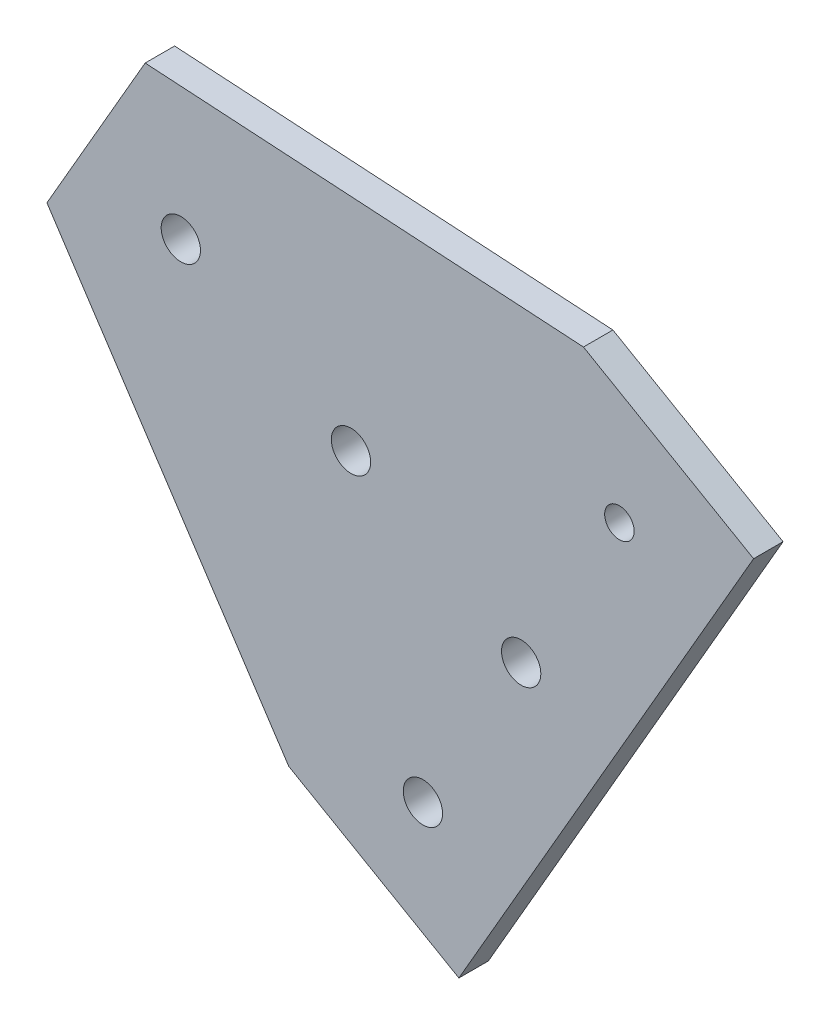
ISO-10303-21;
HEADER;
FILE_DESCRIPTION(('STEP AP214'),'2;1');
FILE_NAME('part.step','',(''),(''),'','','');
FILE_SCHEMA(('AUTOMOTIVE_DESIGN { 1 0 10303 214 1 1 1 1 }'));
ENDSEC;
DATA;
#1=APPLICATION_CONTEXT('core data for automotive mechanical design processes');
#2=APPLICATION_PROTOCOL_DEFINITION('international standard','automotive_design',2000,#1);
#3=PRODUCT_CONTEXT('',#1,'mechanical');
#4=PRODUCT('Part','Part','',(#3));
#5=PRODUCT_RELATED_PRODUCT_CATEGORY('part','',(#4));
#6=PRODUCT_DEFINITION_FORMATION('','',#4);
#7=PRODUCT_DEFINITION_CONTEXT('part definition',#1,'design');
#8=PRODUCT_DEFINITION('design','',#6,#7);
#9=PRODUCT_DEFINITION_SHAPE('','',#8);
#10=(LENGTH_UNIT() NAMED_UNIT(*) SI_UNIT(.MILLI.,.METRE.));
#11=(NAMED_UNIT(*) PLANE_ANGLE_UNIT() SI_UNIT($,.RADIAN.));
#12=(NAMED_UNIT(*) SI_UNIT($,.STERADIAN.) SOLID_ANGLE_UNIT());
#13=UNCERTAINTY_MEASURE_WITH_UNIT(LENGTH_MEASURE(1.E-05),#10,'distance_accuracy_value','');
#14=(GEOMETRIC_REPRESENTATION_CONTEXT(3) GLOBAL_UNCERTAINTY_ASSIGNED_CONTEXT((#13)) GLOBAL_UNIT_ASSIGNED_CONTEXT((#10,
#11,#12)) REPRESENTATION_CONTEXT('',''));
#15=CARTESIAN_POINT('',(0.,0.,0.));
#16=DIRECTION('',(0.,0.,1.));
#17=DIRECTION('',(1.,0.,0.));
#18=AXIS2_PLACEMENT_3D('',#15,#16,#17);
#19=CARTESIAN_POINT('',(0.,0.,3.));
#20=DIRECTION('',(0.,0.,1.));
#21=DIRECTION('',(1.,0.,0.));
#22=AXIS2_PLACEMENT_3D('',#19,#20,#21);
#23=PLANE('',#22);
#24=CARTESIAN_POINT('',(47.8724037426029,-8.33760315715482,3.));
#25=DIRECTION('',(0.,0.,1.));
#26=DIRECTION('',(1.,0.,0.));
#27=AXIS2_PLACEMENT_3D('',#24,#25,#26);
#28=CIRCLE('',#27,1.99999999999994);
#29=CARTESIAN_POINT('',(49.8724037426029,-8.33760315715482,3.));
#30=VERTEX_POINT('',#29);
#31=EDGE_CURVE('E222',#30,#30,#28,.T.);
#32=ORIENTED_EDGE('',*,*,#31,.F.);
#33=EDGE_LOOP('',(#32));
#34=FACE_BOUND('',#33,.T.);
#35=CARTESIAN_POINT('',(65.1929118182918,-18.3376031571546,3.));
#36=DIRECTION('',(0.,0.,1.));
#37=DIRECTION('',(1.,0.,0.));
#38=AXIS2_PLACEMENT_3D('',#35,#36,#37);
#39=CIRCLE('',#38,2.);
#40=CARTESIAN_POINT('',(67.1929118182918,-18.3376031571546,3.));
#41=VERTEX_POINT('',#40);
#42=EDGE_CURVE('E238',#41,#41,#39,.T.);
#43=ORIENTED_EDGE('',*,*,#42,.F.);
#44=EDGE_LOOP('',(#43));
#45=FACE_BOUND('',#44,.T.);
#46=DIRECTION('',(0.866025403784445,-0.499999999999989,0.));
#47=VECTOR('',#46,1.);
#48=CARTESIAN_POINT('',(41.5334077805559,-39.3187982834524,3.));
#49=LINE('',#48,#47);
#50=CARTESIAN_POINT('',(41.5334077805559,-39.3187982834524,3.));
#51=VERTEX_POINT('',#50);
#52=CARTESIAN_POINT('',(58.8531658561367,-49.3183652706879,3.));
#53=VERTEX_POINT('',#52);
#54=EDGE_CURVE('E152',#51,#53,#49,.T.);
#55=ORIENTED_EDGE('',*,*,#54,.T.);
#56=DIRECTION('',(0.5,0.866025403784439,0.));
#57=VECTOR('',#56,1.);
#58=CARTESIAN_POINT('',(58.8531658561367,-49.3183652706879,3.));
#59=LINE('',#58,#57);
#60=CARTESIAN_POINT('',(88.8531658561365,2.64315895637805,3.));
#61=VERTEX_POINT('',#60);
#62=EDGE_CURVE('E100',#53,#61,#59,.T.);
#63=ORIENTED_EDGE('',*,*,#62,.T.);
#64=DIRECTION('',(-0.866025403784436,0.500000000000005,0.));
#65=VECTOR('',#64,1.);
#66=CARTESIAN_POINT('',(88.8531658561365,2.64315895637805,3.));
#67=LINE('',#66,#65);
#68=CARTESIAN_POINT('',(71.532657780447,12.6431589563786,3.));
#69=VERTEX_POINT('',#68);
#70=EDGE_CURVE('E113',#61,#69,#67,.T.);
#71=ORIENTED_EDGE('',*,*,#70,.T.);
#72=DIRECTION('',(-0.9981353174639,0.0610400526805125,0.));
#73=VECTOR('',#72,1.);
#74=CARTESIAN_POINT('',(71.532657780447,12.6431589563786,3.));
#75=LINE('',#74,#73);
#76=CARTESIAN_POINT('',(26.9207630370837,15.3713585878988,3.));
#77=VERTEX_POINT('',#76);
#78=EDGE_CURVE('E107',#69,#77,#75,.T.);
#79=ORIENTED_EDGE('',*,*,#78,.T.);
#80=DIRECTION('',(-0.499999999999987,-0.866025403784446,0.));
#81=VECTOR('',#80,1.);
#82=CARTESIAN_POINT('',(26.9207630370837,15.3713585878988,3.));
#83=LINE('',#82,#81);
#84=CARTESIAN_POINT('',(16.9207630370837,-1.94914948779046,3.));
#85=VERTEX_POINT('',#84);
#86=EDGE_CURVE('E111',#77,#85,#83,.T.);
#87=ORIENTED_EDGE('',*,*,#86,.T.);
#88=DIRECTION('',(0.55004300363725,-0.835136332672524,0.));
#89=VECTOR('',#88,1.);
#90=CARTESIAN_POINT('',(16.9207630370837,-1.94914948779046,3.));
#91=LINE('',#90,#89);
#92=EDGE_CURVE('E63',#85,#51,#91,.T.);
#93=ORIENTED_EDGE('',*,*,#92,.T.);
#94=EDGE_LOOP('',(#55,#63,#71,#79,#87,#93));
#95=FACE_BOUND('',#94,.T.);
#96=CARTESIAN_POINT('',(55.1929118182921,-35.6581112328436,3.));
#97=DIRECTION('',(0.,0.,1.));
#98=DIRECTION('',(1.,0.,0.));
#99=AXIS2_PLACEMENT_3D('',#96,#97,#98);
#100=CIRCLE('',#99,1.99999999999994);
#101=CARTESIAN_POINT('',(57.1929118182921,-35.6581112328436,3.));
#102=VERTEX_POINT('',#101);
#103=EDGE_CURVE('E140',#102,#102,#100,.T.);
#104=ORIENTED_EDGE('',*,*,#103,.F.);
#105=EDGE_LOOP('',(#104));
#106=FACE_BOUND('',#105,.T.);
#107=CARTESIAN_POINT('',(75.1929118182916,-1.01709508146575,3.));
#108=DIRECTION('',(0.,0.,1.));
#109=DIRECTION('',(1.,0.,0.));
#110=AXIS2_PLACEMENT_3D('',#107,#108,#109);
#111=CIRCLE('',#110,1.50000000000002);
#112=CARTESIAN_POINT('',(76.6929118182917,-1.01709508146575,3.));
#113=VERTEX_POINT('',#112);
#114=EDGE_CURVE('E230',#113,#113,#111,.T.);
#115=ORIENTED_EDGE('',*,*,#114,.F.);
#116=EDGE_LOOP('',(#115));
#117=FACE_BOUND('',#116,.T.);
#118=CARTESIAN_POINT('',(30.551895666914,1.66239684284486,3.));
#119=DIRECTION('',(0.,0.,1.));
#120=DIRECTION('',(1.,0.,0.));
#121=AXIS2_PLACEMENT_3D('',#118,#119,#120);
#122=CIRCLE('',#121,1.99999999999994);
#123=CARTESIAN_POINT('',(32.551895666914,1.66239684284486,3.));
#124=VERTEX_POINT('',#123);
#125=EDGE_CURVE('E211',#124,#124,#122,.T.);
#126=ORIENTED_EDGE('',*,*,#125,.F.);
#127=EDGE_LOOP('',(#126));
#128=FACE_BOUND('',#127,.T.);
#129=ADVANCED_FACE('F45',(#34,#45,#95,#106,#117,#128),#23,.T.);
#130=CARTESIAN_POINT('',(0.,0.,0.));
#131=DIRECTION('',(0.,0.,1.));
#132=DIRECTION('',(1.,0.,0.));
#133=AXIS2_PLACEMENT_3D('',#130,#131,#132);
#134=PLANE('',#133);
#135=DIRECTION('',(0.866025403784445,-0.499999999999989,0.));
#136=VECTOR('',#135,1.);
#137=CARTESIAN_POINT('',(41.5334077805559,-39.3187982834524,0.));
#138=LINE('',#137,#136);
#139=CARTESIAN_POINT('',(41.5334077805559,-39.3187982834524,0.));
#140=VERTEX_POINT('',#139);
#141=CARTESIAN_POINT('',(58.8531658561367,-49.3183652706879,0.));
#142=VERTEX_POINT('',#141);
#143=EDGE_CURVE('E135',#140,#142,#138,.T.);
#144=ORIENTED_EDGE('',*,*,#143,.F.);
#145=DIRECTION('',(0.55004300363725,-0.835136332672524,0.));
#146=VECTOR('',#145,1.);
#147=CARTESIAN_POINT('',(16.9207630370837,-1.94914948779046,0.));
#148=LINE('',#147,#146);
#149=CARTESIAN_POINT('',(16.9207630370837,-1.94914948779046,0.));
#150=VERTEX_POINT('',#149);
#151=EDGE_CURVE('E92',#150,#140,#148,.T.);
#152=ORIENTED_EDGE('',*,*,#151,.F.);
#153=DIRECTION('',(-0.499999999999987,-0.866025403784446,0.));
#154=VECTOR('',#153,1.);
#155=CARTESIAN_POINT('',(26.9207630370837,15.3713585878988,0.));
#156=LINE('',#155,#154);
#157=CARTESIAN_POINT('',(26.9207630370837,15.3713585878988,0.));
#158=VERTEX_POINT('',#157);
#159=EDGE_CURVE('E86',#158,#150,#156,.T.);
#160=ORIENTED_EDGE('',*,*,#159,.F.);
#161=DIRECTION('',(-0.9981353174639,0.0610400526805125,0.));
#162=VECTOR('',#161,1.);
#163=CARTESIAN_POINT('',(71.532657780447,12.6431589563786,0.));
#164=LINE('',#163,#162);
#165=CARTESIAN_POINT('',(71.532657780447,12.6431589563786,0.));
#166=VERTEX_POINT('',#165);
#167=EDGE_CURVE('E122',#166,#158,#164,.T.);
#168=ORIENTED_EDGE('',*,*,#167,.F.);
#169=DIRECTION('',(-0.866025403784436,0.500000000000005,0.));
#170=VECTOR('',#169,1.);
#171=CARTESIAN_POINT('',(88.8531658561365,2.64315895637805,0.));
#172=LINE('',#171,#170);
#173=CARTESIAN_POINT('',(88.8531658561365,2.64315895637805,0.));
#174=VERTEX_POINT('',#173);
#175=EDGE_CURVE('E143',#174,#166,#172,.T.);
#176=ORIENTED_EDGE('',*,*,#175,.F.);
#177=DIRECTION('',(0.5,0.866025403784439,0.));
#178=VECTOR('',#177,1.);
#179=CARTESIAN_POINT('',(58.8531658561367,-49.3183652706879,0.));
#180=LINE('',#179,#178);
#181=EDGE_CURVE('E139',#142,#174,#180,.T.);
#182=ORIENTED_EDGE('',*,*,#181,.F.);
#183=EDGE_LOOP('',(#144,#152,#160,#168,#176,#182));
#184=FACE_BOUND('',#183,.T.);
#185=CARTESIAN_POINT('',(55.1929118182921,-35.6581112328436,0.));
#186=DIRECTION('',(0.,0.,1.));
#187=DIRECTION('',(1.,0.,0.));
#188=AXIS2_PLACEMENT_3D('',#185,#186,#187);
#189=CIRCLE('',#188,1.99999999999994);
#190=CARTESIAN_POINT('',(57.1929118182921,-35.6581112328436,0.));
#191=VERTEX_POINT('',#190);
#192=EDGE_CURVE('E242',#191,#191,#189,.T.);
#193=ORIENTED_EDGE('',*,*,#192,.T.);
#194=EDGE_LOOP('',(#193));
#195=FACE_BOUND('',#194,.T.);
#196=CARTESIAN_POINT('',(65.1929118182918,-18.3376031571546,0.));
#197=DIRECTION('',(0.,0.,1.));
#198=DIRECTION('',(1.,0.,0.));
#199=AXIS2_PLACEMENT_3D('',#196,#197,#198);
#200=CIRCLE('',#199,2.);
#201=CARTESIAN_POINT('',(67.1929118182918,-18.3376031571546,0.));
#202=VERTEX_POINT('',#201);
#203=EDGE_CURVE('E234',#202,#202,#200,.T.);
#204=ORIENTED_EDGE('',*,*,#203,.T.);
#205=EDGE_LOOP('',(#204));
#206=FACE_BOUND('',#205,.T.);
#207=CARTESIAN_POINT('',(75.1929118182916,-1.01709508146575,0.));
#208=DIRECTION('',(0.,0.,1.));
#209=DIRECTION('',(1.,0.,0.));
#210=AXIS2_PLACEMENT_3D('',#207,#208,#209);
#211=CIRCLE('',#210,1.50000000000002);
#212=CARTESIAN_POINT('',(76.6929118182917,-1.01709508146575,0.));
#213=VERTEX_POINT('',#212);
#214=EDGE_CURVE('E226',#213,#213,#211,.T.);
#215=ORIENTED_EDGE('',*,*,#214,.T.);
#216=EDGE_LOOP('',(#215));
#217=FACE_BOUND('',#216,.T.);
#218=CARTESIAN_POINT('',(47.8724037426029,-8.33760315715482,0.));
#219=DIRECTION('',(0.,0.,1.));
#220=DIRECTION('',(1.,0.,0.));
#221=AXIS2_PLACEMENT_3D('',#218,#219,#220);
#222=CIRCLE('',#221,1.99999999999994);
#223=CARTESIAN_POINT('',(49.8724037426029,-8.33760315715482,0.));
#224=VERTEX_POINT('',#223);
#225=EDGE_CURVE('E219',#224,#224,#222,.T.);
#226=ORIENTED_EDGE('',*,*,#225,.T.);
#227=EDGE_LOOP('',(#226));
#228=FACE_BOUND('',#227,.T.);
#229=CARTESIAN_POINT('',(30.551895666914,1.66239684284486,0.));
#230=DIRECTION('',(0.,0.,1.));
#231=DIRECTION('',(1.,0.,0.));
#232=AXIS2_PLACEMENT_3D('',#229,#230,#231);
#233=CIRCLE('',#232,1.99999999999994);
#234=CARTESIAN_POINT('',(32.551895666914,1.66239684284486,0.));
#235=VERTEX_POINT('',#234);
#236=EDGE_CURVE('E214',#235,#235,#233,.T.);
#237=ORIENTED_EDGE('',*,*,#236,.T.);
#238=EDGE_LOOP('',(#237));
#239=FACE_BOUND('',#238,.T.);
#240=ADVANCED_FACE('F165',(#184,#195,#206,#217,#228,#239),#134,.F.);
#241=CARTESIAN_POINT('',(41.5334077805559,-39.3187982834524,3.));
#242=DIRECTION('',(0.499999999999989,0.866025403784445,0.));
#243=DIRECTION('',(-0.866025403784445,0.499999999999989,0.));
#244=AXIS2_PLACEMENT_3D('',#241,#242,#243);
#245=PLANE('',#244);
#246=ORIENTED_EDGE('',*,*,#143,.T.);
#247=DIRECTION('',(0.,0.,-1.));
#248=VECTOR('',#247,1.);
#249=CARTESIAN_POINT('',(58.8531658561367,-49.3183652706879,3.));
#250=LINE('',#249,#248);
#251=EDGE_CURVE('E11',#53,#142,#250,.T.);
#252=ORIENTED_EDGE('',*,*,#251,.F.);
#253=ORIENTED_EDGE('',*,*,#54,.F.);
#254=DIRECTION('',(0.,0.,-1.));
#255=VECTOR('',#254,1.);
#256=CARTESIAN_POINT('',(41.5334077805559,-39.3187982834524,3.));
#257=LINE('',#256,#255);
#258=EDGE_CURVE('E131',#51,#140,#257,.T.);
#259=ORIENTED_EDGE('',*,*,#258,.T.);
#260=EDGE_LOOP('',(#246,#252,#253,#259));
#261=FACE_BOUND('',#260,.T.);
#262=ADVANCED_FACE('F47',(#261),#245,.F.);
#263=CARTESIAN_POINT('',(58.8531658561367,-49.3183652706879,3.));
#264=DIRECTION('',(-0.866025403784439,0.5,0.));
#265=DIRECTION('',(-0.5,-0.866025403784439,0.));
#266=AXIS2_PLACEMENT_3D('',#263,#264,#265);
#267=PLANE('',#266);
#268=ORIENTED_EDGE('',*,*,#181,.T.);
#269=DIRECTION('',(0.,0.,-1.));
#270=VECTOR('',#269,1.);
#271=CARTESIAN_POINT('',(88.8531658561365,2.64315895637805,3.));
#272=LINE('',#271,#270);
#273=EDGE_CURVE('E55',#61,#174,#272,.T.);
#274=ORIENTED_EDGE('',*,*,#273,.F.);
#275=ORIENTED_EDGE('',*,*,#62,.F.);
#276=ORIENTED_EDGE('',*,*,#251,.T.);
#277=EDGE_LOOP('',(#268,#274,#275,#276));
#278=FACE_BOUND('',#277,.T.);
#279=ADVANCED_FACE('F320',(#278),#267,.F.);
#280=CARTESIAN_POINT('',(88.8531658561365,2.64315895637805,3.));
#281=DIRECTION('',(-0.500000000000005,-0.866025403784436,0.));
#282=DIRECTION('',(0.866025403784436,-0.500000000000005,0.));
#283=AXIS2_PLACEMENT_3D('',#280,#281,#282);
#284=PLANE('',#283);
#285=ORIENTED_EDGE('',*,*,#175,.T.);
#286=DIRECTION('',(0.,0.,-1.));
#287=VECTOR('',#286,1.);
#288=CARTESIAN_POINT('',(71.532657780447,12.6431589563786,3.));
#289=LINE('',#288,#287);
#290=EDGE_CURVE('E124',#69,#166,#289,.T.);
#291=ORIENTED_EDGE('',*,*,#290,.F.);
#292=ORIENTED_EDGE('',*,*,#70,.F.);
#293=ORIENTED_EDGE('',*,*,#273,.T.);
#294=EDGE_LOOP('',(#285,#291,#292,#293));
#295=FACE_BOUND('',#294,.T.);
#296=ADVANCED_FACE('F162',(#295),#284,.F.);
#297=CARTESIAN_POINT('',(71.532657780447,12.6431589563786,3.));
#298=DIRECTION('',(-0.0610400526805125,-0.9981353174639,0.));
#299=DIRECTION('',(0.9981353174639,-0.0610400526805125,0.));
#300=AXIS2_PLACEMENT_3D('',#297,#298,#299);
#301=PLANE('',#300);
#302=ORIENTED_EDGE('',*,*,#167,.T.);
#303=DIRECTION('',(0.,0.,-1.));
#304=VECTOR('',#303,1.);
#305=CARTESIAN_POINT('',(26.9207630370837,15.3713585878988,3.));
#306=LINE('',#305,#304);
#307=EDGE_CURVE('E119',#77,#158,#306,.T.);
#308=ORIENTED_EDGE('',*,*,#307,.F.);
#309=ORIENTED_EDGE('',*,*,#78,.F.);
#310=ORIENTED_EDGE('',*,*,#290,.T.);
#311=EDGE_LOOP('',(#302,#308,#309,#310));
#312=FACE_BOUND('',#311,.T.);
#313=ADVANCED_FACE('F120',(#312),#301,.F.);
#314=CARTESIAN_POINT('',(26.9207630370837,15.3713585878988,3.));
#315=DIRECTION('',(0.866025403784446,-0.499999999999987,0.));
#316=DIRECTION('',(0.499999999999987,0.866025403784446,0.));
#317=AXIS2_PLACEMENT_3D('',#314,#315,#316);
#318=PLANE('',#317);
#319=ORIENTED_EDGE('',*,*,#159,.T.);
#320=DIRECTION('',(0.,0.,-1.));
#321=VECTOR('',#320,1.);
#322=CARTESIAN_POINT('',(16.9207630370837,-1.94914948779046,3.));
#323=LINE('',#322,#321);
#324=EDGE_CURVE('E125',#85,#150,#323,.T.);
#325=ORIENTED_EDGE('',*,*,#324,.F.);
#326=ORIENTED_EDGE('',*,*,#86,.F.);
#327=ORIENTED_EDGE('',*,*,#307,.T.);
#328=EDGE_LOOP('',(#319,#325,#326,#327));
#329=FACE_BOUND('',#328,.T.);
#330=ADVANCED_FACE('F127',(#329),#318,.F.);
#331=CARTESIAN_POINT('',(16.9207630370837,-1.94914948779046,3.));
#332=DIRECTION('',(0.835136332672524,0.55004300363725,0.));
#333=DIRECTION('',(-0.55004300363725,0.835136332672524,0.));
#334=AXIS2_PLACEMENT_3D('',#331,#332,#333);
#335=PLANE('',#334);
#336=ORIENTED_EDGE('',*,*,#151,.T.);
#337=ORIENTED_EDGE('',*,*,#258,.F.);
#338=ORIENTED_EDGE('',*,*,#92,.F.);
#339=ORIENTED_EDGE('',*,*,#324,.T.);
#340=EDGE_LOOP('',(#336,#337,#338,#339));
#341=FACE_BOUND('',#340,.T.);
#342=ADVANCED_FACE('F170',(#341),#335,.F.);
#343=CARTESIAN_POINT('',(55.1929118182921,-35.6581112328436,3.));
#344=DIRECTION('',(0.,0.,-1.));
#345=DIRECTION('',(-1.,0.,0.));
#346=AXIS2_PLACEMENT_3D('',#343,#344,#345);
#347=CYLINDRICAL_SURFACE('',#346,1.99999999999994);
#348=ORIENTED_EDGE('',*,*,#103,.T.);
#349=EDGE_LOOP('',(#348));
#350=FACE_BOUND('',#349,.T.);
#351=ORIENTED_EDGE('',*,*,#192,.F.);
#352=EDGE_LOOP('',(#351));
#353=FACE_BOUND('',#352,.T.);
#354=ADVANCED_FACE('F172',(#350,#353),#347,.F.);
#355=CARTESIAN_POINT('',(65.1929118182918,-18.3376031571546,3.));
#356=DIRECTION('',(0.,0.,-1.));
#357=DIRECTION('',(-1.,0.,0.));
#358=AXIS2_PLACEMENT_3D('',#355,#356,#357);
#359=CYLINDRICAL_SURFACE('',#358,2.);
#360=ORIENTED_EDGE('',*,*,#42,.T.);
#361=EDGE_LOOP('',(#360));
#362=FACE_BOUND('',#361,.T.);
#363=ORIENTED_EDGE('',*,*,#203,.F.);
#364=EDGE_LOOP('',(#363));
#365=FACE_BOUND('',#364,.T.);
#366=ADVANCED_FACE('F178',(#362,#365),#359,.F.);
#367=CARTESIAN_POINT('',(75.1929118182916,-1.01709508146575,3.));
#368=DIRECTION('',(0.,0.,-1.));
#369=DIRECTION('',(-1.,0.,0.));
#370=AXIS2_PLACEMENT_3D('',#367,#368,#369);
#371=CYLINDRICAL_SURFACE('',#370,1.50000000000002);
#372=ORIENTED_EDGE('',*,*,#114,.T.);
#373=EDGE_LOOP('',(#372));
#374=FACE_BOUND('',#373,.T.);
#375=ORIENTED_EDGE('',*,*,#214,.F.);
#376=EDGE_LOOP('',(#375));
#377=FACE_BOUND('',#376,.T.);
#378=ADVANCED_FACE('F194',(#374,#377),#371,.F.);
#379=CARTESIAN_POINT('',(47.8724037426029,-8.33760315715482,3.));
#380=DIRECTION('',(0.,0.,-1.));
#381=DIRECTION('',(-1.,0.,0.));
#382=AXIS2_PLACEMENT_3D('',#379,#380,#381);
#383=CYLINDRICAL_SURFACE('',#382,1.99999999999994);
#384=ORIENTED_EDGE('',*,*,#31,.T.);
#385=EDGE_LOOP('',(#384));
#386=FACE_BOUND('',#385,.T.);
#387=ORIENTED_EDGE('',*,*,#225,.F.);
#388=EDGE_LOOP('',(#387));
#389=FACE_BOUND('',#388,.T.);
#390=ADVANCED_FACE('F198',(#386,#389),#383,.F.);
#391=CARTESIAN_POINT('',(30.551895666914,1.66239684284486,3.));
#392=DIRECTION('',(0.,0.,-1.));
#393=DIRECTION('',(-1.,0.,0.));
#394=AXIS2_PLACEMENT_3D('',#391,#392,#393);
#395=CYLINDRICAL_SURFACE('',#394,1.99999999999994);
#396=ORIENTED_EDGE('',*,*,#125,.T.);
#397=EDGE_LOOP('',(#396));
#398=FACE_BOUND('',#397,.T.);
#399=ORIENTED_EDGE('',*,*,#236,.F.);
#400=EDGE_LOOP('',(#399));
#401=FACE_BOUND('',#400,.T.);
#402=ADVANCED_FACE('F202',(#398,#401),#395,.F.);
#403=CLOSED_SHELL('',(#129,#240,#262,#279,#296,#313,#330,#342,#354,#366,#378,#390,#402));
#404=MANIFOLD_SOLID_BREP('B2',#403);
#405=ADVANCED_BREP_SHAPE_REPRESENTATION('',(#18,#404),#14);
#406=SHAPE_DEFINITION_REPRESENTATION(#9,#405);
ENDSEC;
END-ISO-10303-21;
